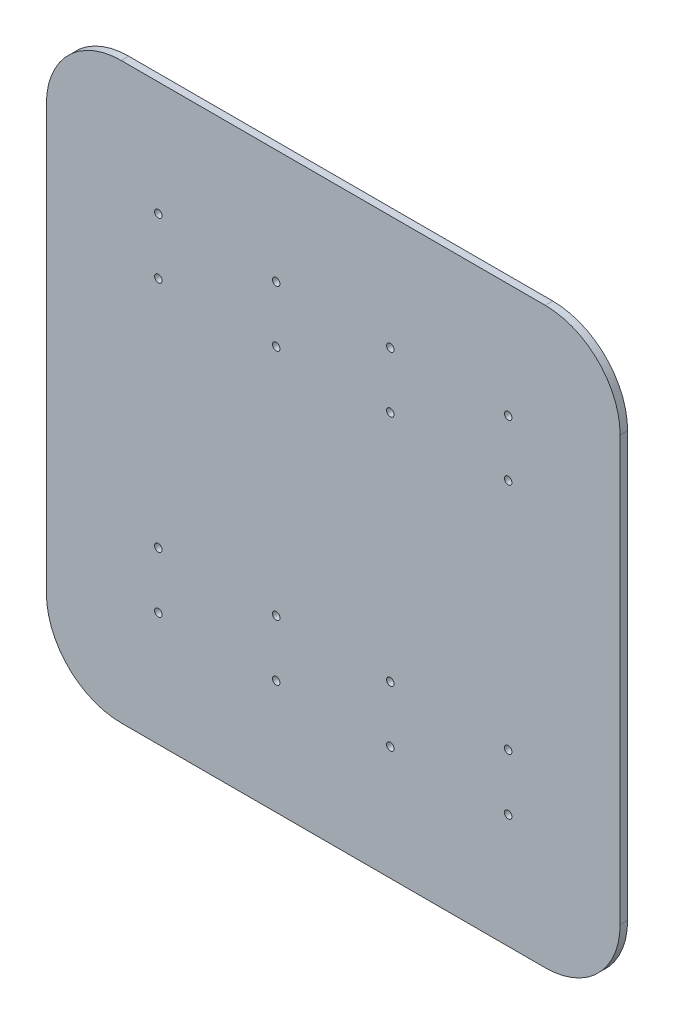
ISO-10303-21;
HEADER;
FILE_DESCRIPTION(('STEP AP214'),'2;1');
FILE_NAME('part.step','',(''),(''),'','','');
FILE_SCHEMA(('AUTOMOTIVE_DESIGN { 1 0 10303 214 1 1 1 1 }'));
ENDSEC;
DATA;
#1=APPLICATION_CONTEXT('core data for automotive mechanical design processes');
#2=APPLICATION_PROTOCOL_DEFINITION('international standard','automotive_design',2000,#1);
#3=PRODUCT_CONTEXT('',#1,'mechanical');
#4=PRODUCT('Part','Part','',(#3));
#5=PRODUCT_RELATED_PRODUCT_CATEGORY('part','',(#4));
#6=PRODUCT_DEFINITION_FORMATION('','',#4);
#7=PRODUCT_DEFINITION_CONTEXT('part definition',#1,'design');
#8=PRODUCT_DEFINITION('design','',#6,#7);
#9=PRODUCT_DEFINITION_SHAPE('','',#8);
#10=(LENGTH_UNIT() NAMED_UNIT(*) SI_UNIT(.MILLI.,.METRE.));
#11=(NAMED_UNIT(*) PLANE_ANGLE_UNIT() SI_UNIT($,.RADIAN.));
#12=(NAMED_UNIT(*) SI_UNIT($,.STERADIAN.) SOLID_ANGLE_UNIT());
#13=UNCERTAINTY_MEASURE_WITH_UNIT(LENGTH_MEASURE(1.E-05),#10,'distance_accuracy_value','');
#14=(GEOMETRIC_REPRESENTATION_CONTEXT(3) GLOBAL_UNCERTAINTY_ASSIGNED_CONTEXT((#13)) GLOBAL_UNIT_ASSIGNED_CONTEXT((#10,
#11,#12)) REPRESENTATION_CONTEXT('',''));
#15=CARTESIAN_POINT('',(0.,0.,0.));
#16=DIRECTION('',(0.,0.,1.));
#17=DIRECTION('',(1.,0.,0.));
#18=AXIS2_PLACEMENT_3D('',#15,#16,#17);
#19=CARTESIAN_POINT('',(0.,0.,3.));
#20=DIRECTION('',(0.,0.,1.));
#21=DIRECTION('',(1.,0.,0.));
#22=AXIS2_PLACEMENT_3D('',#19,#20,#21);
#23=PLANE('',#22);
#24=CARTESIAN_POINT('',(-22.8750000000001,-46.75,3.));
#25=DIRECTION('',(0.,0.,1.));
#26=DIRECTION('',(1.,0.,0.));
#27=AXIS2_PLACEMENT_3D('',#24,#25,#26);
#28=CIRCLE('',#27,1.5);
#29=CARTESIAN_POINT('',(-21.3750000000001,-46.75,3.));
#30=VERTEX_POINT('',#29);
#31=EDGE_CURVE('E438',#30,#30,#28,.F.);
#32=ORIENTED_EDGE('',*,*,#31,.T.);
#33=EDGE_LOOP('',(#32));
#34=FACE_BOUND('',#33,.T.);
#35=CARTESIAN_POINT('',(-70.1250000000001,-46.75,3.));
#36=DIRECTION('',(0.,0.,1.));
#37=DIRECTION('',(1.,0.,0.));
#38=AXIS2_PLACEMENT_3D('',#35,#36,#37);
#39=CIRCLE('',#38,1.5);
#40=CARTESIAN_POINT('',(-68.6250000000001,-46.75,3.));
#41=VERTEX_POINT('',#40);
#42=EDGE_CURVE('E444',#41,#41,#39,.T.);
#43=ORIENTED_EDGE('',*,*,#42,.F.);
#44=EDGE_LOOP('',(#43));
#45=FACE_BOUND('',#44,.T.);
#46=CARTESIAN_POINT('',(22.875,-69.25,3.));
#47=DIRECTION('',(0.,0.,1.));
#48=DIRECTION('',(1.,0.,0.));
#49=AXIS2_PLACEMENT_3D('',#46,#47,#48);
#50=CIRCLE('',#49,1.5);
#51=CARTESIAN_POINT('',(24.375,-69.25,3.));
#52=VERTEX_POINT('',#51);
#53=EDGE_CURVE('E462',#52,#52,#50,.F.);
#54=ORIENTED_EDGE('',*,*,#53,.T.);
#55=EDGE_LOOP('',(#54));
#56=FACE_BOUND('',#55,.T.);
#57=CARTESIAN_POINT('',(22.8749999999999,-46.7500000000001,3.));
#58=DIRECTION('',(0.,0.,1.));
#59=DIRECTION('',(1.,0.,0.));
#60=AXIS2_PLACEMENT_3D('',#57,#58,#59);
#61=CIRCLE('',#60,1.5);
#62=CARTESIAN_POINT('',(24.3749999999999,-46.7500000000001,3.));
#63=VERTEX_POINT('',#62);
#64=EDGE_CURVE('E468',#63,#63,#61,.T.);
#65=ORIENTED_EDGE('',*,*,#64,.F.);
#66=EDGE_LOOP('',(#65));
#67=FACE_BOUND('',#66,.T.);
#68=CARTESIAN_POINT('',(70.125,69.25,3.));
#69=DIRECTION('',(0.,0.,1.));
#70=DIRECTION('',(1.,0.,0.));
#71=AXIS2_PLACEMENT_3D('',#68,#69,#70);
#72=CIRCLE('',#71,1.5);
#73=CARTESIAN_POINT('',(71.625,69.25,3.));
#74=VERTEX_POINT('',#73);
#75=EDGE_CURVE('E486',#74,#74,#72,.F.);
#76=ORIENTED_EDGE('',*,*,#75,.T.);
#77=EDGE_LOOP('',(#76));
#78=FACE_BOUND('',#77,.T.);
#79=CARTESIAN_POINT('',(70.125,46.7500000000001,3.));
#80=DIRECTION('',(0.,0.,1.));
#81=DIRECTION('',(1.,0.,0.));
#82=AXIS2_PLACEMENT_3D('',#79,#80,#81);
#83=CIRCLE('',#82,1.5);
#84=CARTESIAN_POINT('',(71.625,46.7500000000001,3.));
#85=VERTEX_POINT('',#84);
#86=EDGE_CURVE('E492',#85,#85,#83,.T.);
#87=ORIENTED_EDGE('',*,*,#86,.F.);
#88=EDGE_LOOP('',(#87));
#89=FACE_BOUND('',#88,.T.);
#90=CARTESIAN_POINT('',(-70.1250000000001,46.75,3.));
#91=DIRECTION('',(0.,0.,1.));
#92=DIRECTION('',(1.,0.,0.));
#93=AXIS2_PLACEMENT_3D('',#90,#91,#92);
#94=CIRCLE('',#93,1.5);
#95=CARTESIAN_POINT('',(-68.6250000000001,46.75,3.));
#96=VERTEX_POINT('',#95);
#97=EDGE_CURVE('E516',#96,#96,#94,.F.);
#98=ORIENTED_EDGE('',*,*,#97,.T.);
#99=EDGE_LOOP('',(#98));
#100=FACE_BOUND('',#99,.T.);
#101=CARTESIAN_POINT('',(-70.1250000000001,69.25,3.));
#102=DIRECTION('',(0.,0.,1.));
#103=DIRECTION('',(1.,0.,0.));
#104=AXIS2_PLACEMENT_3D('',#101,#102,#103);
#105=CIRCLE('',#104,1.5);
#106=CARTESIAN_POINT('',(-68.6250000000001,69.25,3.));
#107=VERTEX_POINT('',#106);
#108=EDGE_CURVE('E164',#107,#107,#105,.T.);
#109=ORIENTED_EDGE('',*,*,#108,.F.);
#110=EDGE_LOOP('',(#109));
#111=FACE_BOUND('',#110,.T.);
#112=DIRECTION('',(-1.,0.,0.));
#113=VECTOR('',#112,1.);
#114=CARTESIAN_POINT('',(115.,115.,3.));
#115=LINE('',#114,#113);
#116=CARTESIAN_POINT('',(85.,115.,3.));
#117=VERTEX_POINT('',#116);
#118=CARTESIAN_POINT('',(-85.,115.,3.));
#119=VERTEX_POINT('',#118);
#120=EDGE_CURVE('E122',#117,#119,#115,.T.);
#121=ORIENTED_EDGE('',*,*,#120,.T.);
#122=CARTESIAN_POINT('',(-85.0000000000001,85.,3.));
#123=DIRECTION('',(0.,0.,1.));
#124=DIRECTION('',(1.,0.,0.));
#125=AXIS2_PLACEMENT_3D('',#122,#123,#124);
#126=CIRCLE('',#125,30.);
#127=CARTESIAN_POINT('',(-115.,85.,3.));
#128=VERTEX_POINT('',#127);
#129=EDGE_CURVE('E11',#119,#128,#126,.T.);
#130=ORIENTED_EDGE('',*,*,#129,.T.);
#131=DIRECTION('',(0.,-1.,0.));
#132=VECTOR('',#131,1.);
#133=CARTESIAN_POINT('',(-115.,-115.,3.));
#134=LINE('',#133,#132);
#135=CARTESIAN_POINT('',(-115.,-85.,3.));
#136=VERTEX_POINT('',#135);
#137=EDGE_CURVE('E157',#128,#136,#134,.T.);
#138=ORIENTED_EDGE('',*,*,#137,.T.);
#139=CARTESIAN_POINT('',(-85.0000000000001,-85.,3.));
#140=DIRECTION('',(0.,0.,1.));
#141=DIRECTION('',(1.,0.,0.));
#142=AXIS2_PLACEMENT_3D('',#139,#140,#141);
#143=CIRCLE('',#142,30.);
#144=CARTESIAN_POINT('',(-85.,-115.,3.));
#145=VERTEX_POINT('',#144);
#146=EDGE_CURVE('E147',#136,#145,#143,.T.);
#147=ORIENTED_EDGE('',*,*,#146,.T.);
#148=DIRECTION('',(1.,0.,0.));
#149=VECTOR('',#148,1.);
#150=CARTESIAN_POINT('',(115.,-115.,3.));
#151=LINE('',#150,#149);
#152=CARTESIAN_POINT('',(85.,-115.,3.));
#153=VERTEX_POINT('',#152);
#154=EDGE_CURVE('E158',#145,#153,#151,.T.);
#155=ORIENTED_EDGE('',*,*,#154,.T.);
#156=CARTESIAN_POINT('',(85.,-85.,3.));
#157=DIRECTION('',(0.,0.,1.));
#158=DIRECTION('',(1.,0.,0.));
#159=AXIS2_PLACEMENT_3D('',#156,#157,#158);
#160=CIRCLE('',#159,30.);
#161=CARTESIAN_POINT('',(115.,-85.,3.));
#162=VERTEX_POINT('',#161);
#163=EDGE_CURVE('E134',#153,#162,#160,.T.);
#164=ORIENTED_EDGE('',*,*,#163,.T.);
#165=DIRECTION('',(0.,1.,0.));
#166=VECTOR('',#165,1.);
#167=CARTESIAN_POINT('',(115.,-115.,3.));
#168=LINE('',#167,#166);
#169=CARTESIAN_POINT('',(115.,85.,3.));
#170=VERTEX_POINT('',#169);
#171=EDGE_CURVE('E125',#162,#170,#168,.T.);
#172=ORIENTED_EDGE('',*,*,#171,.T.);
#173=CARTESIAN_POINT('',(85.,85.,3.));
#174=DIRECTION('',(0.,0.,1.));
#175=DIRECTION('',(1.,0.,0.));
#176=AXIS2_PLACEMENT_3D('',#173,#174,#175);
#177=CIRCLE('',#176,30.);
#178=EDGE_CURVE('E117',#170,#117,#177,.T.);
#179=ORIENTED_EDGE('',*,*,#178,.T.);
#180=EDGE_LOOP('',(#121,#130,#138,#147,#155,#164,#172,#179));
#181=FACE_BOUND('',#180,.T.);
#182=CARTESIAN_POINT('',(-22.8750000000001,46.75,3.));
#183=DIRECTION('',(0.,0.,1.));
#184=DIRECTION('',(1.,0.,0.));
#185=AXIS2_PLACEMENT_3D('',#182,#183,#184);
#186=CIRCLE('',#185,1.5);
#187=CARTESIAN_POINT('',(-21.3750000000001,46.75,3.));
#188=VERTEX_POINT('',#187);
#189=EDGE_CURVE('E510',#188,#188,#186,.T.);
#190=ORIENTED_EDGE('',*,*,#189,.F.);
#191=EDGE_LOOP('',(#190));
#192=FACE_BOUND('',#191,.T.);
#193=CARTESIAN_POINT('',(22.8750000000001,69.25,3.));
#194=DIRECTION('',(0.,0.,1.));
#195=DIRECTION('',(1.,0.,0.));
#196=AXIS2_PLACEMENT_3D('',#193,#194,#195);
#197=CIRCLE('',#196,1.5);
#198=CARTESIAN_POINT('',(24.3750000000001,69.25,3.));
#199=VERTEX_POINT('',#198);
#200=EDGE_CURVE('E504',#199,#199,#197,.T.);
#201=ORIENTED_EDGE('',*,*,#200,.F.);
#202=EDGE_LOOP('',(#201));
#203=FACE_BOUND('',#202,.T.);
#204=CARTESIAN_POINT('',(22.875,46.7500000000001,3.));
#205=DIRECTION('',(0.,0.,1.));
#206=DIRECTION('',(1.,0.,0.));
#207=AXIS2_PLACEMENT_3D('',#204,#205,#206);
#208=CIRCLE('',#207,1.5);
#209=CARTESIAN_POINT('',(24.375,46.7500000000001,3.));
#210=VERTEX_POINT('',#209);
#211=EDGE_CURVE('E498',#210,#210,#208,.F.);
#212=ORIENTED_EDGE('',*,*,#211,.T.);
#213=EDGE_LOOP('',(#212));
#214=FACE_BOUND('',#213,.T.);
#215=CARTESIAN_POINT('',(70.1249999999999,-69.25,3.));
#216=DIRECTION('',(0.,0.,1.));
#217=DIRECTION('',(1.,0.,0.));
#218=AXIS2_PLACEMENT_3D('',#215,#216,#217);
#219=CIRCLE('',#218,1.5);
#220=CARTESIAN_POINT('',(71.6249999999999,-69.25,3.));
#221=VERTEX_POINT('',#220);
#222=EDGE_CURVE('E480',#221,#221,#219,.T.);
#223=ORIENTED_EDGE('',*,*,#222,.F.);
#224=EDGE_LOOP('',(#223));
#225=FACE_BOUND('',#224,.T.);
#226=CARTESIAN_POINT('',(70.1249999999999,-46.7500000000001,3.));
#227=DIRECTION('',(0.,0.,1.));
#228=DIRECTION('',(1.,0.,0.));
#229=AXIS2_PLACEMENT_3D('',#226,#227,#228);
#230=CIRCLE('',#229,1.5);
#231=CARTESIAN_POINT('',(71.6249999999999,-46.7500000000001,3.));
#232=VERTEX_POINT('',#231);
#233=EDGE_CURVE('E474',#232,#232,#230,.F.);
#234=ORIENTED_EDGE('',*,*,#233,.T.);
#235=EDGE_LOOP('',(#234));
#236=FACE_BOUND('',#235,.T.);
#237=CARTESIAN_POINT('',(-22.8750000000001,-69.25,3.));
#238=DIRECTION('',(0.,0.,1.));
#239=DIRECTION('',(1.,0.,0.));
#240=AXIS2_PLACEMENT_3D('',#237,#238,#239);
#241=CIRCLE('',#240,1.5);
#242=CARTESIAN_POINT('',(-21.3750000000001,-69.25,3.));
#243=VERTEX_POINT('',#242);
#244=EDGE_CURVE('E456',#243,#243,#241,.T.);
#245=ORIENTED_EDGE('',*,*,#244,.F.);
#246=EDGE_LOOP('',(#245));
#247=FACE_BOUND('',#246,.T.);
#248=CARTESIAN_POINT('',(-70.1250000000001,-69.25,3.));
#249=DIRECTION('',(0.,0.,1.));
#250=DIRECTION('',(1.,0.,0.));
#251=AXIS2_PLACEMENT_3D('',#248,#249,#250);
#252=CIRCLE('',#251,1.5);
#253=CARTESIAN_POINT('',(-68.6250000000001,-69.25,3.));
#254=VERTEX_POINT('',#253);
#255=EDGE_CURVE('E450',#254,#254,#252,.F.);
#256=ORIENTED_EDGE('',*,*,#255,.T.);
#257=EDGE_LOOP('',(#256));
#258=FACE_BOUND('',#257,.T.);
#259=CARTESIAN_POINT('',(-22.8750000000001,69.25,3.));
#260=DIRECTION('',(0.,0.,-1.));
#261=DIRECTION('',(-1.,0.,0.));
#262=AXIS2_PLACEMENT_3D('',#259,#260,#261);
#263=CIRCLE('',#262,1.5);
#264=CARTESIAN_POINT('',(-24.3750000000001,69.25,3.));
#265=VERTEX_POINT('',#264);
#266=EDGE_CURVE('E433',#265,#265,#263,.T.);
#267=ORIENTED_EDGE('',*,*,#266,.T.);
#268=EDGE_LOOP('',(#267));
#269=FACE_BOUND('',#268,.T.);
#270=ADVANCED_FACE('F32',(#34,#45,#56,#67,#78,#89,#100,#111,#181,#192,#203,#214,#225,#236,#247,
#258,#269),#23,.T.);
#271=CARTESIAN_POINT('',(0.,0.,0.));
#272=DIRECTION('',(0.,0.,1.));
#273=DIRECTION('',(1.,0.,0.));
#274=AXIS2_PLACEMENT_3D('',#271,#272,#273);
#275=PLANE('',#274);
#276=CARTESIAN_POINT('',(-22.8750000000001,-46.75,0.));
#277=DIRECTION('',(0.,0.,1.));
#278=DIRECTION('',(1.,0.,0.));
#279=AXIS2_PLACEMENT_3D('',#276,#277,#278);
#280=CIRCLE('',#279,1.5);
#281=CARTESIAN_POINT('',(-21.3750000000001,-46.75,0.));
#282=VERTEX_POINT('',#281);
#283=EDGE_CURVE('E435',#282,#282,#280,.F.);
#284=ORIENTED_EDGE('',*,*,#283,.F.);
#285=EDGE_LOOP('',(#284));
#286=FACE_BOUND('',#285,.T.);
#287=CARTESIAN_POINT('',(-70.1250000000001,-46.75,0.));
#288=DIRECTION('',(0.,0.,1.));
#289=DIRECTION('',(1.,0.,0.));
#290=AXIS2_PLACEMENT_3D('',#287,#288,#289);
#291=CIRCLE('',#290,1.5);
#292=CARTESIAN_POINT('',(-68.6250000000001,-46.75,0.));
#293=VERTEX_POINT('',#292);
#294=EDGE_CURVE('E442',#293,#293,#291,.T.);
#295=ORIENTED_EDGE('',*,*,#294,.T.);
#296=EDGE_LOOP('',(#295));
#297=FACE_BOUND('',#296,.T.);
#298=CARTESIAN_POINT('',(22.875,-69.25,0.));
#299=DIRECTION('',(0.,0.,1.));
#300=DIRECTION('',(1.,0.,0.));
#301=AXIS2_PLACEMENT_3D('',#298,#299,#300);
#302=CIRCLE('',#301,1.5);
#303=CARTESIAN_POINT('',(24.375,-69.25,0.));
#304=VERTEX_POINT('',#303);
#305=EDGE_CURVE('E459',#304,#304,#302,.F.);
#306=ORIENTED_EDGE('',*,*,#305,.F.);
#307=EDGE_LOOP('',(#306));
#308=FACE_BOUND('',#307,.T.);
#309=CARTESIAN_POINT('',(22.8749999999999,-46.7500000000001,0.));
#310=DIRECTION('',(0.,0.,1.));
#311=DIRECTION('',(1.,0.,0.));
#312=AXIS2_PLACEMENT_3D('',#309,#310,#311);
#313=CIRCLE('',#312,1.5);
#314=CARTESIAN_POINT('',(24.3749999999999,-46.7500000000001,0.));
#315=VERTEX_POINT('',#314);
#316=EDGE_CURVE('E465',#315,#315,#313,.T.);
#317=ORIENTED_EDGE('',*,*,#316,.T.);
#318=EDGE_LOOP('',(#317));
#319=FACE_BOUND('',#318,.T.);
#320=CARTESIAN_POINT('',(70.125,69.25,0.));
#321=DIRECTION('',(0.,0.,1.));
#322=DIRECTION('',(1.,0.,0.));
#323=AXIS2_PLACEMENT_3D('',#320,#321,#322);
#324=CIRCLE('',#323,1.5);
#325=CARTESIAN_POINT('',(71.625,69.25,0.));
#326=VERTEX_POINT('',#325);
#327=EDGE_CURVE('E483',#326,#326,#324,.F.);
#328=ORIENTED_EDGE('',*,*,#327,.F.);
#329=EDGE_LOOP('',(#328));
#330=FACE_BOUND('',#329,.T.);
#331=CARTESIAN_POINT('',(70.125,46.7500000000001,0.));
#332=DIRECTION('',(0.,0.,1.));
#333=DIRECTION('',(1.,0.,0.));
#334=AXIS2_PLACEMENT_3D('',#331,#332,#333);
#335=CIRCLE('',#334,1.5);
#336=CARTESIAN_POINT('',(71.625,46.7500000000001,0.));
#337=VERTEX_POINT('',#336);
#338=EDGE_CURVE('E489',#337,#337,#335,.T.);
#339=ORIENTED_EDGE('',*,*,#338,.T.);
#340=EDGE_LOOP('',(#339));
#341=FACE_BOUND('',#340,.T.);
#342=CARTESIAN_POINT('',(-70.1250000000001,46.75,0.));
#343=DIRECTION('',(0.,0.,1.));
#344=DIRECTION('',(1.,0.,0.));
#345=AXIS2_PLACEMENT_3D('',#342,#343,#344);
#346=CIRCLE('',#345,1.5);
#347=CARTESIAN_POINT('',(-68.6250000000001,46.75,0.));
#348=VERTEX_POINT('',#347);
#349=EDGE_CURVE('E513',#348,#348,#346,.F.);
#350=ORIENTED_EDGE('',*,*,#349,.F.);
#351=EDGE_LOOP('',(#350));
#352=FACE_BOUND('',#351,.T.);
#353=CARTESIAN_POINT('',(-70.1250000000001,69.25,0.));
#354=DIRECTION('',(0.,0.,1.));
#355=DIRECTION('',(1.,0.,0.));
#356=AXIS2_PLACEMENT_3D('',#353,#354,#355);
#357=CIRCLE('',#356,1.5);
#358=CARTESIAN_POINT('',(-68.6250000000001,69.25,0.));
#359=VERTEX_POINT('',#358);
#360=EDGE_CURVE('E169',#359,#359,#357,.T.);
#361=ORIENTED_EDGE('',*,*,#360,.T.);
#362=EDGE_LOOP('',(#361));
#363=FACE_BOUND('',#362,.T.);
#364=DIRECTION('',(0.,-1.,0.));
#365=VECTOR('',#364,1.);
#366=CARTESIAN_POINT('',(-115.,-115.,0.));
#367=LINE('',#366,#365);
#368=CARTESIAN_POINT('',(-115.,85.,0.));
#369=VERTEX_POINT('',#368);
#370=CARTESIAN_POINT('',(-115.,-85.,0.));
#371=VERTEX_POINT('',#370);
#372=EDGE_CURVE('E153',#369,#371,#367,.T.);
#373=ORIENTED_EDGE('',*,*,#372,.F.);
#374=CARTESIAN_POINT('',(-85.0000000000001,85.,0.));
#375=DIRECTION('',(0.,0.,1.));
#376=DIRECTION('',(1.,0.,0.));
#377=AXIS2_PLACEMENT_3D('',#374,#375,#376);
#378=CIRCLE('',#377,30.);
#379=CARTESIAN_POINT('',(-85.,115.,0.));
#380=VERTEX_POINT('',#379);
#381=EDGE_CURVE('E40',#369,#380,#378,.F.);
#382=ORIENTED_EDGE('',*,*,#381,.T.);
#383=DIRECTION('',(-1.,0.,0.));
#384=VECTOR('',#383,1.);
#385=CARTESIAN_POINT('',(115.,115.,0.));
#386=LINE('',#385,#384);
#387=CARTESIAN_POINT('',(85.,115.,0.));
#388=VERTEX_POINT('',#387);
#389=EDGE_CURVE('E105',#388,#380,#386,.T.);
#390=ORIENTED_EDGE('',*,*,#389,.F.);
#391=CARTESIAN_POINT('',(85.,85.,0.));
#392=DIRECTION('',(0.,0.,1.));
#393=DIRECTION('',(1.,0.,0.));
#394=AXIS2_PLACEMENT_3D('',#391,#392,#393);
#395=CIRCLE('',#394,30.);
#396=CARTESIAN_POINT('',(115.,85.,0.));
#397=VERTEX_POINT('',#396);
#398=EDGE_CURVE('E109',#388,#397,#395,.F.);
#399=ORIENTED_EDGE('',*,*,#398,.T.);
#400=DIRECTION('',(0.,1.,0.));
#401=VECTOR('',#400,1.);
#402=CARTESIAN_POINT('',(115.,-115.,0.));
#403=LINE('',#402,#401);
#404=CARTESIAN_POINT('',(115.,-85.,0.));
#405=VERTEX_POINT('',#404);
#406=EDGE_CURVE('E95',#405,#397,#403,.T.);
#407=ORIENTED_EDGE('',*,*,#406,.F.);
#408=CARTESIAN_POINT('',(85.,-85.,0.));
#409=DIRECTION('',(0.,0.,1.));
#410=DIRECTION('',(1.,0.,0.));
#411=AXIS2_PLACEMENT_3D('',#408,#409,#410);
#412=CIRCLE('',#411,30.);
#413=CARTESIAN_POINT('',(85.,-115.,0.));
#414=VERTEX_POINT('',#413);
#415=EDGE_CURVE('E136',#405,#414,#412,.F.);
#416=ORIENTED_EDGE('',*,*,#415,.T.);
#417=DIRECTION('',(1.,0.,0.));
#418=VECTOR('',#417,1.);
#419=CARTESIAN_POINT('',(115.,-115.,0.));
#420=LINE('',#419,#418);
#421=CARTESIAN_POINT('',(-85.,-115.,0.));
#422=VERTEX_POINT('',#421);
#423=EDGE_CURVE('E106',#422,#414,#420,.T.);
#424=ORIENTED_EDGE('',*,*,#423,.F.);
#425=CARTESIAN_POINT('',(-85.0000000000001,-85.,0.));
#426=DIRECTION('',(0.,0.,1.));
#427=DIRECTION('',(1.,0.,0.));
#428=AXIS2_PLACEMENT_3D('',#425,#426,#427);
#429=CIRCLE('',#428,30.);
#430=EDGE_CURVE('E144',#422,#371,#429,.F.);
#431=ORIENTED_EDGE('',*,*,#430,.T.);
#432=EDGE_LOOP('',(#373,#382,#390,#399,#407,#416,#424,#431));
#433=FACE_BOUND('',#432,.T.);
#434=CARTESIAN_POINT('',(-22.8750000000001,46.75,0.));
#435=DIRECTION('',(0.,0.,1.));
#436=DIRECTION('',(1.,0.,0.));
#437=AXIS2_PLACEMENT_3D('',#434,#435,#436);
#438=CIRCLE('',#437,1.5);
#439=CARTESIAN_POINT('',(-21.3750000000001,46.75,0.));
#440=VERTEX_POINT('',#439);
#441=EDGE_CURVE('E507',#440,#440,#438,.T.);
#442=ORIENTED_EDGE('',*,*,#441,.T.);
#443=EDGE_LOOP('',(#442));
#444=FACE_BOUND('',#443,.T.);
#445=CARTESIAN_POINT('',(22.8750000000001,69.25,0.));
#446=DIRECTION('',(0.,0.,1.));
#447=DIRECTION('',(1.,0.,0.));
#448=AXIS2_PLACEMENT_3D('',#445,#446,#447);
#449=CIRCLE('',#448,1.5);
#450=CARTESIAN_POINT('',(24.3750000000001,69.25,0.));
#451=VERTEX_POINT('',#450);
#452=EDGE_CURVE('E501',#451,#451,#449,.T.);
#453=ORIENTED_EDGE('',*,*,#452,.T.);
#454=EDGE_LOOP('',(#453));
#455=FACE_BOUND('',#454,.T.);
#456=CARTESIAN_POINT('',(22.875,46.7500000000001,0.));
#457=DIRECTION('',(0.,0.,1.));
#458=DIRECTION('',(1.,0.,0.));
#459=AXIS2_PLACEMENT_3D('',#456,#457,#458);
#460=CIRCLE('',#459,1.5);
#461=CARTESIAN_POINT('',(24.375,46.7500000000001,0.));
#462=VERTEX_POINT('',#461);
#463=EDGE_CURVE('E495',#462,#462,#460,.F.);
#464=ORIENTED_EDGE('',*,*,#463,.F.);
#465=EDGE_LOOP('',(#464));
#466=FACE_BOUND('',#465,.T.);
#467=CARTESIAN_POINT('',(70.1249999999999,-69.25,0.));
#468=DIRECTION('',(0.,0.,1.));
#469=DIRECTION('',(1.,0.,0.));
#470=AXIS2_PLACEMENT_3D('',#467,#468,#469);
#471=CIRCLE('',#470,1.5);
#472=CARTESIAN_POINT('',(71.6249999999999,-69.25,0.));
#473=VERTEX_POINT('',#472);
#474=EDGE_CURVE('E477',#473,#473,#471,.T.);
#475=ORIENTED_EDGE('',*,*,#474,.T.);
#476=EDGE_LOOP('',(#475));
#477=FACE_BOUND('',#476,.T.);
#478=CARTESIAN_POINT('',(70.1249999999999,-46.7500000000001,0.));
#479=DIRECTION('',(0.,0.,1.));
#480=DIRECTION('',(1.,0.,0.));
#481=AXIS2_PLACEMENT_3D('',#478,#479,#480);
#482=CIRCLE('',#481,1.5);
#483=CARTESIAN_POINT('',(71.6249999999999,-46.7500000000001,0.));
#484=VERTEX_POINT('',#483);
#485=EDGE_CURVE('E471',#484,#484,#482,.F.);
#486=ORIENTED_EDGE('',*,*,#485,.F.);
#487=EDGE_LOOP('',(#486));
#488=FACE_BOUND('',#487,.T.);
#489=CARTESIAN_POINT('',(-22.8750000000001,-69.25,0.));
#490=DIRECTION('',(0.,0.,1.));
#491=DIRECTION('',(1.,0.,0.));
#492=AXIS2_PLACEMENT_3D('',#489,#490,#491);
#493=CIRCLE('',#492,1.5);
#494=CARTESIAN_POINT('',(-21.3750000000001,-69.25,0.));
#495=VERTEX_POINT('',#494);
#496=EDGE_CURVE('E453',#495,#495,#493,.T.);
#497=ORIENTED_EDGE('',*,*,#496,.T.);
#498=EDGE_LOOP('',(#497));
#499=FACE_BOUND('',#498,.T.);
#500=CARTESIAN_POINT('',(-70.1250000000001,-69.25,0.));
#501=DIRECTION('',(0.,0.,1.));
#502=DIRECTION('',(1.,0.,0.));
#503=AXIS2_PLACEMENT_3D('',#500,#501,#502);
#504=CIRCLE('',#503,1.5);
#505=CARTESIAN_POINT('',(-68.6250000000001,-69.25,0.));
#506=VERTEX_POINT('',#505);
#507=EDGE_CURVE('E447',#506,#506,#504,.F.);
#508=ORIENTED_EDGE('',*,*,#507,.F.);
#509=EDGE_LOOP('',(#508));
#510=FACE_BOUND('',#509,.T.);
#511=CARTESIAN_POINT('',(-22.8750000000001,69.25,0.));
#512=DIRECTION('',(0.,0.,-1.));
#513=DIRECTION('',(-1.,0.,0.));
#514=AXIS2_PLACEMENT_3D('',#511,#512,#513);
#515=CIRCLE('',#514,1.5);
#516=CARTESIAN_POINT('',(-24.3750000000001,69.25,0.));
#517=VERTEX_POINT('',#516);
#518=EDGE_CURVE('E430',#517,#517,#515,.T.);
#519=ORIENTED_EDGE('',*,*,#518,.F.);
#520=EDGE_LOOP('',(#519));
#521=FACE_BOUND('',#520,.T.);
#522=ADVANCED_FACE('F111',(#286,#297,#308,#319,#330,#341,#352,#363,#433,#444,#455,#466,#477,
#488,#499,#510,#521),#275,.F.);
#523=CARTESIAN_POINT('',(-85.0000000000001,85.,3.));
#524=DIRECTION('',(0.,0.,1.));
#525=DIRECTION('',(1.,0.,0.));
#526=AXIS2_PLACEMENT_3D('',#523,#524,#525);
#527=CYLINDRICAL_SURFACE('',#526,30.);
#528=DIRECTION('',(0.,0.,1.));
#529=VECTOR('',#528,1.);
#530=CARTESIAN_POINT('',(-85.0000000000001,115.,3.));
#531=LINE('',#530,#529);
#532=EDGE_CURVE('E149',#380,#119,#531,.T.);
#533=ORIENTED_EDGE('',*,*,#532,.F.);
#534=ORIENTED_EDGE('',*,*,#381,.F.);
#535=DIRECTION('',(0.,0.,1.));
#536=VECTOR('',#535,1.);
#537=CARTESIAN_POINT('',(-115.,85.,3.));
#538=LINE('',#537,#536);
#539=EDGE_CURVE('E152',#128,#369,#538,.F.);
#540=ORIENTED_EDGE('',*,*,#539,.F.);
#541=ORIENTED_EDGE('',*,*,#129,.F.);
#542=EDGE_LOOP('',(#533,#534,#540,#541));
#543=FACE_BOUND('',#542,.T.);
#544=ADVANCED_FACE('F34',(#543),#527,.T.);
#545=CARTESIAN_POINT('',(-85.0000000000001,-85.,3.));
#546=DIRECTION('',(0.,0.,1.));
#547=DIRECTION('',(1.,0.,0.));
#548=AXIS2_PLACEMENT_3D('',#545,#546,#547);
#549=CYLINDRICAL_SURFACE('',#548,30.);
#550=DIRECTION('',(0.,0.,1.));
#551=VECTOR('',#550,1.);
#552=CARTESIAN_POINT('',(-115.,-85.,3.));
#553=LINE('',#552,#551);
#554=EDGE_CURVE('E138',#371,#136,#553,.T.);
#555=ORIENTED_EDGE('',*,*,#554,.F.);
#556=ORIENTED_EDGE('',*,*,#430,.F.);
#557=DIRECTION('',(0.,0.,1.));
#558=VECTOR('',#557,1.);
#559=CARTESIAN_POINT('',(-85.0000000000001,-115.,3.));
#560=LINE('',#559,#558);
#561=EDGE_CURVE('E141',#145,#422,#560,.F.);
#562=ORIENTED_EDGE('',*,*,#561,.F.);
#563=ORIENTED_EDGE('',*,*,#146,.F.);
#564=EDGE_LOOP('',(#555,#556,#562,#563));
#565=FACE_BOUND('',#564,.T.);
#566=ADVANCED_FACE('F182',(#565),#549,.T.);
#567=CARTESIAN_POINT('',(85.,-85.,3.));
#568=DIRECTION('',(0.,0.,-1.));
#569=DIRECTION('',(-1.,0.,0.));
#570=AXIS2_PLACEMENT_3D('',#567,#568,#569);
#571=CYLINDRICAL_SURFACE('',#570,30.);
#572=DIRECTION('',(0.,0.,-1.));
#573=VECTOR('',#572,1.);
#574=CARTESIAN_POINT('',(115.,-85.,3.));
#575=LINE('',#574,#573);
#576=EDGE_CURVE('E102',#162,#405,#575,.T.);
#577=ORIENTED_EDGE('',*,*,#576,.F.);
#578=ORIENTED_EDGE('',*,*,#163,.F.);
#579=DIRECTION('',(0.,0.,-1.));
#580=VECTOR('',#579,1.);
#581=CARTESIAN_POINT('',(85.,-115.,3.));
#582=LINE('',#581,#580);
#583=EDGE_CURVE('E131',#414,#153,#582,.F.);
#584=ORIENTED_EDGE('',*,*,#583,.F.);
#585=ORIENTED_EDGE('',*,*,#415,.F.);
#586=EDGE_LOOP('',(#577,#578,#584,#585));
#587=FACE_BOUND('',#586,.T.);
#588=ADVANCED_FACE('F178',(#587),#571,.T.);
#589=CARTESIAN_POINT('',(85.,85.,3.));
#590=DIRECTION('',(0.,0.,1.));
#591=DIRECTION('',(1.,0.,0.));
#592=AXIS2_PLACEMENT_3D('',#589,#590,#591);
#593=CYLINDRICAL_SURFACE('',#592,30.);
#594=DIRECTION('',(0.,0.,1.));
#595=VECTOR('',#594,1.);
#596=CARTESIAN_POINT('',(115.,85.,3.));
#597=LINE('',#596,#595);
#598=EDGE_CURVE('E100',#397,#170,#597,.T.);
#599=ORIENTED_EDGE('',*,*,#598,.F.);
#600=ORIENTED_EDGE('',*,*,#398,.F.);
#601=DIRECTION('',(0.,0.,1.));
#602=VECTOR('',#601,1.);
#603=CARTESIAN_POINT('',(85.,115.,3.));
#604=LINE('',#603,#602);
#605=EDGE_CURVE('E118',#117,#388,#604,.F.);
#606=ORIENTED_EDGE('',*,*,#605,.F.);
#607=ORIENTED_EDGE('',*,*,#178,.F.);
#608=EDGE_LOOP('',(#599,#600,#606,#607));
#609=FACE_BOUND('',#608,.T.);
#610=ADVANCED_FACE('F121',(#609),#593,.T.);
#611=CARTESIAN_POINT('',(-115.,-115.,3.));
#612=DIRECTION('',(1.,0.,0.));
#613=DIRECTION('',(0.,0.,-1.));
#614=AXIS2_PLACEMENT_3D('',#611,#612,#613);
#615=PLANE('',#614);
#616=ORIENTED_EDGE('',*,*,#137,.F.);
#617=ORIENTED_EDGE('',*,*,#539,.T.);
#618=ORIENTED_EDGE('',*,*,#372,.T.);
#619=ORIENTED_EDGE('',*,*,#554,.T.);
#620=EDGE_LOOP('',(#616,#617,#618,#619));
#621=FACE_BOUND('',#620,.T.);
#622=ADVANCED_FACE('F184',(#621),#615,.F.);
#623=CARTESIAN_POINT('',(115.,-115.,3.));
#624=DIRECTION('',(0.,1.,0.));
#625=DIRECTION('',(-1.,0.,0.));
#626=AXIS2_PLACEMENT_3D('',#623,#624,#625);
#627=PLANE('',#626);
#628=ORIENTED_EDGE('',*,*,#154,.F.);
#629=ORIENTED_EDGE('',*,*,#561,.T.);
#630=ORIENTED_EDGE('',*,*,#423,.T.);
#631=ORIENTED_EDGE('',*,*,#583,.T.);
#632=EDGE_LOOP('',(#628,#629,#630,#631));
#633=FACE_BOUND('',#632,.T.);
#634=ADVANCED_FACE('F173',(#633),#627,.F.);
#635=CARTESIAN_POINT('',(115.,-115.,3.));
#636=DIRECTION('',(-1.,0.,0.));
#637=DIRECTION('',(0.,0.,1.));
#638=AXIS2_PLACEMENT_3D('',#635,#636,#637);
#639=PLANE('',#638);
#640=ORIENTED_EDGE('',*,*,#171,.F.);
#641=ORIENTED_EDGE('',*,*,#576,.T.);
#642=ORIENTED_EDGE('',*,*,#406,.T.);
#643=ORIENTED_EDGE('',*,*,#598,.T.);
#644=EDGE_LOOP('',(#640,#641,#642,#643));
#645=FACE_BOUND('',#644,.T.);
#646=ADVANCED_FACE('F98',(#645),#639,.F.);
#647=CARTESIAN_POINT('',(115.,115.,3.));
#648=DIRECTION('',(0.,-1.,0.));
#649=DIRECTION('',(1.,0.,0.));
#650=AXIS2_PLACEMENT_3D('',#647,#648,#649);
#651=PLANE('',#650);
#652=ORIENTED_EDGE('',*,*,#389,.T.);
#653=ORIENTED_EDGE('',*,*,#532,.T.);
#654=ORIENTED_EDGE('',*,*,#120,.F.);
#655=ORIENTED_EDGE('',*,*,#605,.T.);
#656=EDGE_LOOP('',(#652,#653,#654,#655));
#657=FACE_BOUND('',#656,.T.);
#658=ADVANCED_FACE('F156',(#657),#651,.F.);
#659=CARTESIAN_POINT('',(-70.1250000000001,69.25,0.));
#660=DIRECTION('',(0.,0.,1.));
#661=DIRECTION('',(1.,0.,0.));
#662=AXIS2_PLACEMENT_3D('',#659,#660,#661);
#663=CYLINDRICAL_SURFACE('',#662,1.5);
#664=ORIENTED_EDGE('',*,*,#360,.F.);
#665=EDGE_LOOP('',(#664));
#666=FACE_BOUND('',#665,.T.);
#667=ORIENTED_EDGE('',*,*,#108,.T.);
#668=EDGE_LOOP('',(#667));
#669=FACE_BOUND('',#668,.T.);
#670=ADVANCED_FACE('F204',(#666,#669),#663,.F.);
#671=CARTESIAN_POINT('',(-70.1250000000001,46.75,0.));
#672=DIRECTION('',(0.,0.,1.));
#673=DIRECTION('',(1.,0.,0.));
#674=AXIS2_PLACEMENT_3D('',#671,#672,#673);
#675=CYLINDRICAL_SURFACE('',#674,1.5);
#676=ORIENTED_EDGE('',*,*,#349,.T.);
#677=EDGE_LOOP('',(#676));
#678=FACE_BOUND('',#677,.T.);
#679=ORIENTED_EDGE('',*,*,#97,.F.);
#680=EDGE_LOOP('',(#679));
#681=FACE_BOUND('',#680,.T.);
#682=ADVANCED_FACE('F226',(#678,#681),#675,.F.);
#683=CARTESIAN_POINT('',(-22.8750000000001,46.75,0.));
#684=DIRECTION('',(0.,0.,1.));
#685=DIRECTION('',(1.,0.,0.));
#686=AXIS2_PLACEMENT_3D('',#683,#684,#685);
#687=CYLINDRICAL_SURFACE('',#686,1.5);
#688=ORIENTED_EDGE('',*,*,#441,.F.);
#689=EDGE_LOOP('',(#688));
#690=FACE_BOUND('',#689,.T.);
#691=ORIENTED_EDGE('',*,*,#189,.T.);
#692=EDGE_LOOP('',(#691));
#693=FACE_BOUND('',#692,.T.);
#694=ADVANCED_FACE('F234',(#690,#693),#687,.F.);
#695=CARTESIAN_POINT('',(22.8750000000001,69.25,0.));
#696=DIRECTION('',(0.,0.,1.));
#697=DIRECTION('',(1.,0.,0.));
#698=AXIS2_PLACEMENT_3D('',#695,#696,#697);
#699=CYLINDRICAL_SURFACE('',#698,1.5);
#700=ORIENTED_EDGE('',*,*,#452,.F.);
#701=EDGE_LOOP('',(#700));
#702=FACE_BOUND('',#701,.T.);
#703=ORIENTED_EDGE('',*,*,#200,.T.);
#704=EDGE_LOOP('',(#703));
#705=FACE_BOUND('',#704,.T.);
#706=ADVANCED_FACE('F241',(#702,#705),#699,.F.);
#707=CARTESIAN_POINT('',(22.875,46.7500000000001,0.));
#708=DIRECTION('',(0.,0.,1.));
#709=DIRECTION('',(1.,0.,0.));
#710=AXIS2_PLACEMENT_3D('',#707,#708,#709);
#711=CYLINDRICAL_SURFACE('',#710,1.5);
#712=ORIENTED_EDGE('',*,*,#463,.T.);
#713=EDGE_LOOP('',(#712));
#714=FACE_BOUND('',#713,.T.);
#715=ORIENTED_EDGE('',*,*,#211,.F.);
#716=EDGE_LOOP('',(#715));
#717=FACE_BOUND('',#716,.T.);
#718=ADVANCED_FACE('F249',(#714,#717),#711,.F.);
#719=CARTESIAN_POINT('',(70.125,46.7500000000001,0.));
#720=DIRECTION('',(0.,0.,1.));
#721=DIRECTION('',(1.,0.,0.));
#722=AXIS2_PLACEMENT_3D('',#719,#720,#721);
#723=CYLINDRICAL_SURFACE('',#722,1.5);
#724=ORIENTED_EDGE('',*,*,#338,.F.);
#725=EDGE_LOOP('',(#724));
#726=FACE_BOUND('',#725,.T.);
#727=ORIENTED_EDGE('',*,*,#86,.T.);
#728=EDGE_LOOP('',(#727));
#729=FACE_BOUND('',#728,.T.);
#730=ADVANCED_FACE('F257',(#726,#729),#723,.F.);
#731=CARTESIAN_POINT('',(70.125,69.25,0.));
#732=DIRECTION('',(0.,0.,1.));
#733=DIRECTION('',(1.,0.,0.));
#734=AXIS2_PLACEMENT_3D('',#731,#732,#733);
#735=CYLINDRICAL_SURFACE('',#734,1.5);
#736=ORIENTED_EDGE('',*,*,#327,.T.);
#737=EDGE_LOOP('',(#736));
#738=FACE_BOUND('',#737,.T.);
#739=ORIENTED_EDGE('',*,*,#75,.F.);
#740=EDGE_LOOP('',(#739));
#741=FACE_BOUND('',#740,.T.);
#742=ADVANCED_FACE('F265',(#738,#741),#735,.F.);
#743=CARTESIAN_POINT('',(70.1249999999999,-69.25,0.));
#744=DIRECTION('',(0.,0.,1.));
#745=DIRECTION('',(1.,0.,0.));
#746=AXIS2_PLACEMENT_3D('',#743,#744,#745);
#747=CYLINDRICAL_SURFACE('',#746,1.5);
#748=ORIENTED_EDGE('',*,*,#474,.F.);
#749=EDGE_LOOP('',(#748));
#750=FACE_BOUND('',#749,.T.);
#751=ORIENTED_EDGE('',*,*,#222,.T.);
#752=EDGE_LOOP('',(#751));
#753=FACE_BOUND('',#752,.T.);
#754=ADVANCED_FACE('F273',(#750,#753),#747,.F.);
#755=CARTESIAN_POINT('',(70.1249999999999,-46.7500000000001,0.));
#756=DIRECTION('',(0.,0.,1.));
#757=DIRECTION('',(1.,0.,0.));
#758=AXIS2_PLACEMENT_3D('',#755,#756,#757);
#759=CYLINDRICAL_SURFACE('',#758,1.5);
#760=ORIENTED_EDGE('',*,*,#485,.T.);
#761=EDGE_LOOP('',(#760));
#762=FACE_BOUND('',#761,.T.);
#763=ORIENTED_EDGE('',*,*,#233,.F.);
#764=EDGE_LOOP('',(#763));
#765=FACE_BOUND('',#764,.T.);
#766=ADVANCED_FACE('F281',(#762,#765),#759,.F.);
#767=CARTESIAN_POINT('',(22.8749999999999,-46.7500000000001,0.));
#768=DIRECTION('',(0.,0.,1.));
#769=DIRECTION('',(1.,0.,0.));
#770=AXIS2_PLACEMENT_3D('',#767,#768,#769);
#771=CYLINDRICAL_SURFACE('',#770,1.5);
#772=ORIENTED_EDGE('',*,*,#316,.F.);
#773=EDGE_LOOP('',(#772));
#774=FACE_BOUND('',#773,.T.);
#775=ORIENTED_EDGE('',*,*,#64,.T.);
#776=EDGE_LOOP('',(#775));
#777=FACE_BOUND('',#776,.T.);
#778=ADVANCED_FACE('F289',(#774,#777),#771,.F.);
#779=CARTESIAN_POINT('',(22.875,-69.25,0.));
#780=DIRECTION('',(0.,0.,1.));
#781=DIRECTION('',(1.,0.,0.));
#782=AXIS2_PLACEMENT_3D('',#779,#780,#781);
#783=CYLINDRICAL_SURFACE('',#782,1.5);
#784=ORIENTED_EDGE('',*,*,#305,.T.);
#785=EDGE_LOOP('',(#784));
#786=FACE_BOUND('',#785,.T.);
#787=ORIENTED_EDGE('',*,*,#53,.F.);
#788=EDGE_LOOP('',(#787));
#789=FACE_BOUND('',#788,.T.);
#790=ADVANCED_FACE('F297',(#786,#789),#783,.F.);
#791=CARTESIAN_POINT('',(-22.8750000000001,-69.25,0.));
#792=DIRECTION('',(0.,0.,1.));
#793=DIRECTION('',(1.,0.,0.));
#794=AXIS2_PLACEMENT_3D('',#791,#792,#793);
#795=CYLINDRICAL_SURFACE('',#794,1.5);
#796=ORIENTED_EDGE('',*,*,#496,.F.);
#797=EDGE_LOOP('',(#796));
#798=FACE_BOUND('',#797,.T.);
#799=ORIENTED_EDGE('',*,*,#244,.T.);
#800=EDGE_LOOP('',(#799));
#801=FACE_BOUND('',#800,.T.);
#802=ADVANCED_FACE('F305',(#798,#801),#795,.F.);
#803=CARTESIAN_POINT('',(-70.1250000000001,-69.25,0.));
#804=DIRECTION('',(0.,0.,1.));
#805=DIRECTION('',(1.,0.,0.));
#806=AXIS2_PLACEMENT_3D('',#803,#804,#805);
#807=CYLINDRICAL_SURFACE('',#806,1.5);
#808=ORIENTED_EDGE('',*,*,#507,.T.);
#809=EDGE_LOOP('',(#808));
#810=FACE_BOUND('',#809,.T.);
#811=ORIENTED_EDGE('',*,*,#255,.F.);
#812=EDGE_LOOP('',(#811));
#813=FACE_BOUND('',#812,.T.);
#814=ADVANCED_FACE('F313',(#810,#813),#807,.F.);
#815=CARTESIAN_POINT('',(-70.1250000000001,-46.75,0.));
#816=DIRECTION('',(0.,0.,1.));
#817=DIRECTION('',(1.,0.,0.));
#818=AXIS2_PLACEMENT_3D('',#815,#816,#817);
#819=CYLINDRICAL_SURFACE('',#818,1.5);
#820=ORIENTED_EDGE('',*,*,#294,.F.);
#821=EDGE_LOOP('',(#820));
#822=FACE_BOUND('',#821,.T.);
#823=ORIENTED_EDGE('',*,*,#42,.T.);
#824=EDGE_LOOP('',(#823));
#825=FACE_BOUND('',#824,.T.);
#826=ADVANCED_FACE('F321',(#822,#825),#819,.F.);
#827=CARTESIAN_POINT('',(-22.8750000000001,-46.75,0.));
#828=DIRECTION('',(0.,0.,1.));
#829=DIRECTION('',(1.,0.,0.));
#830=AXIS2_PLACEMENT_3D('',#827,#828,#829);
#831=CYLINDRICAL_SURFACE('',#830,1.5);
#832=ORIENTED_EDGE('',*,*,#283,.T.);
#833=EDGE_LOOP('',(#832));
#834=FACE_BOUND('',#833,.T.);
#835=ORIENTED_EDGE('',*,*,#31,.F.);
#836=EDGE_LOOP('',(#835));
#837=FACE_BOUND('',#836,.T.);
#838=ADVANCED_FACE('F329',(#834,#837),#831,.F.);
#839=CARTESIAN_POINT('',(-22.8750000000001,69.25,0.));
#840=DIRECTION('',(0.,0.,1.));
#841=DIRECTION('',(1.,0.,0.));
#842=AXIS2_PLACEMENT_3D('',#839,#840,#841);
#843=CYLINDRICAL_SURFACE('',#842,1.5);
#844=ORIENTED_EDGE('',*,*,#518,.T.);
#845=EDGE_LOOP('',(#844));
#846=FACE_BOUND('',#845,.T.);
#847=ORIENTED_EDGE('',*,*,#266,.F.);
#848=EDGE_LOOP('',(#847));
#849=FACE_BOUND('',#848,.T.);
#850=ADVANCED_FACE('F337',(#846,#849),#843,.F.);
#851=CLOSED_SHELL('',(#270,#522,#544,#566,#588,#610,#622,#634,#646,#658,#670,#682,#694,#706,
#718,#730,#742,#754,#766,#778,#790,#802,#814,#826,#838,#850));
#852=MANIFOLD_SOLID_BREP('B2',#851);
#853=ADVANCED_BREP_SHAPE_REPRESENTATION('',(#18,#852),#14);
#854=SHAPE_DEFINITION_REPRESENTATION(#9,#853);
ENDSEC;
END-ISO-10303-21;
